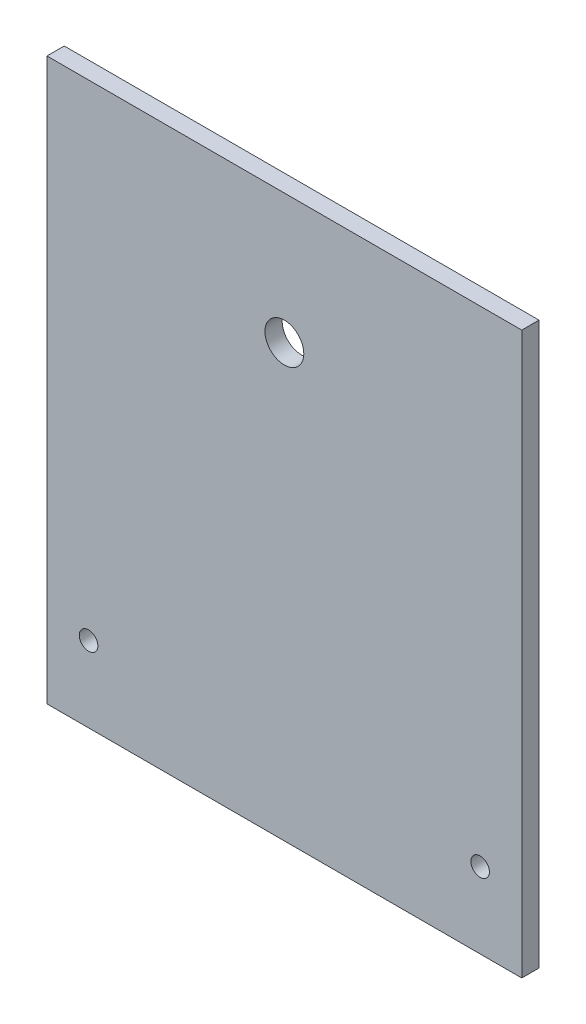
ISO-10303-21;
HEADER;
FILE_DESCRIPTION(('STEP AP214'),'2;1');
FILE_NAME('part.step','',(''),(''),'','','');
FILE_SCHEMA(('AUTOMOTIVE_DESIGN { 1 0 10303 214 1 1 1 1 }'));
ENDSEC;
DATA;
#1=APPLICATION_CONTEXT('core data for automotive mechanical design processes');
#2=APPLICATION_PROTOCOL_DEFINITION('international standard','automotive_design',2000,#1);
#3=PRODUCT_CONTEXT('',#1,'mechanical');
#4=PRODUCT('Part','Part','',(#3));
#5=PRODUCT_RELATED_PRODUCT_CATEGORY('part','',(#4));
#6=PRODUCT_DEFINITION_FORMATION('','',#4);
#7=PRODUCT_DEFINITION_CONTEXT('part definition',#1,'design');
#8=PRODUCT_DEFINITION('design','',#6,#7);
#9=PRODUCT_DEFINITION_SHAPE('','',#8);
#10=(LENGTH_UNIT() NAMED_UNIT(*) SI_UNIT(.MILLI.,.METRE.));
#11=(NAMED_UNIT(*) PLANE_ANGLE_UNIT() SI_UNIT($,.RADIAN.));
#12=(NAMED_UNIT(*) SI_UNIT($,.STERADIAN.) SOLID_ANGLE_UNIT());
#13=UNCERTAINTY_MEASURE_WITH_UNIT(LENGTH_MEASURE(1.E-05),#10,'distance_accuracy_value','');
#14=(GEOMETRIC_REPRESENTATION_CONTEXT(3) GLOBAL_UNCERTAINTY_ASSIGNED_CONTEXT((#13)) GLOBAL_UNIT_ASSIGNED_CONTEXT((#10,
#11,#12)) REPRESENTATION_CONTEXT('',''));
#15=CARTESIAN_POINT('',(0.,0.,0.));
#16=DIRECTION('',(0.,0.,1.));
#17=DIRECTION('',(1.,0.,0.));
#18=AXIS2_PLACEMENT_3D('',#15,#16,#17);
#19=CARTESIAN_POINT('',(55.,65.,4.));
#20=DIRECTION('',(-1.,0.,0.));
#21=DIRECTION('',(0.,-1.,0.));
#22=AXIS2_PLACEMENT_3D('',#19,#20,#21);
#23=PLANE('',#22);
#24=DIRECTION('',(0.,1.,0.));
#25=VECTOR('',#24,1.);
#26=CARTESIAN_POINT('',(55.,65.,0.));
#27=LINE('',#26,#25);
#28=CARTESIAN_POINT('',(55.,-65.,0.));
#29=VERTEX_POINT('',#28);
#30=CARTESIAN_POINT('',(55.,65.,0.));
#31=VERTEX_POINT('',#30);
#32=EDGE_CURVE('E95',#29,#31,#27,.T.);
#33=ORIENTED_EDGE('',*,*,#32,.T.);
#34=DIRECTION('',(0.,0.,-1.));
#35=VECTOR('',#34,1.);
#36=CARTESIAN_POINT('',(55.,65.,4.));
#37=LINE('',#36,#35);
#38=CARTESIAN_POINT('',(55.,65.,4.));
#39=VERTEX_POINT('',#38);
#40=EDGE_CURVE('E11',#39,#31,#37,.T.);
#41=ORIENTED_EDGE('',*,*,#40,.F.);
#42=DIRECTION('',(0.,1.,0.));
#43=VECTOR('',#42,1.);
#44=CARTESIAN_POINT('',(55.,65.,4.));
#45=LINE('',#44,#43);
#46=CARTESIAN_POINT('',(55.,-65.,4.));
#47=VERTEX_POINT('',#46);
#48=EDGE_CURVE('E83',#47,#39,#45,.T.);
#49=ORIENTED_EDGE('',*,*,#48,.F.);
#50=DIRECTION('',(0.,0.,-1.));
#51=VECTOR('',#50,1.);
#52=CARTESIAN_POINT('',(55.,-65.,4.));
#53=LINE('',#52,#51);
#54=EDGE_CURVE('E91',#47,#29,#53,.T.);
#55=ORIENTED_EDGE('',*,*,#54,.T.);
#56=EDGE_LOOP('',(#33,#41,#49,#55));
#57=FACE_BOUND('',#56,.T.);
#58=ADVANCED_FACE('F32',(#57),#23,.F.);
#59=CARTESIAN_POINT('',(-55.,65.,4.));
#60=DIRECTION('',(0.,-1.,0.));
#61=DIRECTION('',(0.,0.,-1.));
#62=AXIS2_PLACEMENT_3D('',#59,#60,#61);
#63=PLANE('',#62);
#64=DIRECTION('',(-1.,0.,0.));
#65=VECTOR('',#64,1.);
#66=CARTESIAN_POINT('',(-55.,65.,0.));
#67=LINE('',#66,#65);
#68=CARTESIAN_POINT('',(-55.,65.,0.));
#69=VERTEX_POINT('',#68);
#70=EDGE_CURVE('E87',#31,#69,#67,.T.);
#71=ORIENTED_EDGE('',*,*,#70,.T.);
#72=DIRECTION('',(0.,0.,-1.));
#73=VECTOR('',#72,1.);
#74=CARTESIAN_POINT('',(-55.,65.,4.));
#75=LINE('',#74,#73);
#76=CARTESIAN_POINT('',(-55.,65.,4.));
#77=VERTEX_POINT('',#76);
#78=EDGE_CURVE('E40',#77,#69,#75,.T.);
#79=ORIENTED_EDGE('',*,*,#78,.F.);
#80=DIRECTION('',(-1.,0.,0.));
#81=VECTOR('',#80,1.);
#82=CARTESIAN_POINT('',(-55.,65.,4.));
#83=LINE('',#82,#81);
#84=EDGE_CURVE('E78',#39,#77,#83,.T.);
#85=ORIENTED_EDGE('',*,*,#84,.F.);
#86=ORIENTED_EDGE('',*,*,#40,.T.);
#87=EDGE_LOOP('',(#71,#79,#85,#86));
#88=FACE_BOUND('',#87,.T.);
#89=ADVANCED_FACE('F86',(#88),#63,.F.);
#90=CARTESIAN_POINT('',(-55.,65.,4.));
#91=DIRECTION('',(1.,0.,0.));
#92=DIRECTION('',(0.,1.,0.));
#93=AXIS2_PLACEMENT_3D('',#90,#91,#92);
#94=PLANE('',#93);
#95=DIRECTION('',(0.,-1.,0.));
#96=VECTOR('',#95,1.);
#97=CARTESIAN_POINT('',(-55.,65.,0.));
#98=LINE('',#97,#96);
#99=CARTESIAN_POINT('',(-55.,-65.,0.));
#100=VERTEX_POINT('',#99);
#101=EDGE_CURVE('E65',#69,#100,#98,.T.);
#102=ORIENTED_EDGE('',*,*,#101,.T.);
#103=DIRECTION('',(0.,0.,-1.));
#104=VECTOR('',#103,1.);
#105=CARTESIAN_POINT('',(-55.,-65.,4.));
#106=LINE('',#105,#104);
#107=CARTESIAN_POINT('',(-55.,-65.,4.));
#108=VERTEX_POINT('',#107);
#109=EDGE_CURVE('E88',#108,#100,#106,.T.);
#110=ORIENTED_EDGE('',*,*,#109,.F.);
#111=DIRECTION('',(0.,-1.,0.));
#112=VECTOR('',#111,1.);
#113=CARTESIAN_POINT('',(-55.,65.,4.));
#114=LINE('',#113,#112);
#115=EDGE_CURVE('E81',#77,#108,#114,.T.);
#116=ORIENTED_EDGE('',*,*,#115,.F.);
#117=ORIENTED_EDGE('',*,*,#78,.T.);
#118=EDGE_LOOP('',(#102,#110,#116,#117));
#119=FACE_BOUND('',#118,.T.);
#120=ADVANCED_FACE('F89',(#119),#94,.F.);
#121=CARTESIAN_POINT('',(-55.,-65.,4.));
#122=DIRECTION('',(0.,1.,0.));
#123=DIRECTION('',(0.,0.,1.));
#124=AXIS2_PLACEMENT_3D('',#121,#122,#123);
#125=PLANE('',#124);
#126=DIRECTION('',(1.,0.,0.));
#127=VECTOR('',#126,1.);
#128=CARTESIAN_POINT('',(-55.,-65.,0.));
#129=LINE('',#128,#127);
#130=EDGE_CURVE('E71',#100,#29,#129,.T.);
#131=ORIENTED_EDGE('',*,*,#130,.T.);
#132=ORIENTED_EDGE('',*,*,#54,.F.);
#133=DIRECTION('',(1.,0.,0.));
#134=VECTOR('',#133,1.);
#135=CARTESIAN_POINT('',(-55.,-65.,4.));
#136=LINE('',#135,#134);
#137=EDGE_CURVE('E48',#108,#47,#136,.T.);
#138=ORIENTED_EDGE('',*,*,#137,.F.);
#139=ORIENTED_EDGE('',*,*,#109,.T.);
#140=EDGE_LOOP('',(#131,#132,#138,#139));
#141=FACE_BOUND('',#140,.T.);
#142=ADVANCED_FACE('F103',(#141),#125,.F.);
#143=CARTESIAN_POINT('',(0.,0.,4.));
#144=DIRECTION('',(0.,0.,1.));
#145=DIRECTION('',(1.,0.,0.));
#146=AXIS2_PLACEMENT_3D('',#143,#144,#145);
#147=PLANE('',#146);
#148=CARTESIAN_POINT('',(45.3611285403604,-47.475954890935,4.));
#149=DIRECTION('',(0.,0.,1.));
#150=DIRECTION('',(1.,0.,0.));
#151=AXIS2_PLACEMENT_3D('',#148,#149,#150);
#152=CIRCLE('',#151,2.15);
#153=CARTESIAN_POINT('',(47.5111285403604,-47.475954890935,4.));
#154=VERTEX_POINT('',#153);
#155=EDGE_CURVE('E121',#154,#154,#152,.T.);
#156=ORIENTED_EDGE('',*,*,#155,.F.);
#157=EDGE_LOOP('',(#156));
#158=FACE_BOUND('',#157,.T.);
#159=CARTESIAN_POINT('',(-45.3611285403604,-47.475954890935,4.));
#160=DIRECTION('',(0.,0.,1.));
#161=DIRECTION('',(1.,0.,0.));
#162=AXIS2_PLACEMENT_3D('',#159,#160,#161);
#163=CIRCLE('',#162,2.15);
#164=CARTESIAN_POINT('',(-43.2111285403604,-47.475954890935,4.));
#165=VERTEX_POINT('',#164);
#166=EDGE_CURVE('E115',#165,#165,#163,.T.);
#167=ORIENTED_EDGE('',*,*,#166,.F.);
#168=EDGE_LOOP('',(#167));
#169=FACE_BOUND('',#168,.T.);
#170=CARTESIAN_POINT('',(0.,34.9932912306538,4.));
#171=DIRECTION('',(0.,0.,1.));
#172=DIRECTION('',(1.,0.,0.));
#173=AXIS2_PLACEMENT_3D('',#170,#171,#172);
#174=CIRCLE('',#173,4.5);
#175=CARTESIAN_POINT('',(4.5,34.9932912306538,4.));
#176=VERTEX_POINT('',#175);
#177=EDGE_CURVE('E109',#176,#176,#174,.T.);
#178=ORIENTED_EDGE('',*,*,#177,.F.);
#179=EDGE_LOOP('',(#178));
#180=FACE_BOUND('',#179,.T.);
#181=ORIENTED_EDGE('',*,*,#48,.T.);
#182=ORIENTED_EDGE('',*,*,#84,.T.);
#183=ORIENTED_EDGE('',*,*,#115,.T.);
#184=ORIENTED_EDGE('',*,*,#137,.T.);
#185=EDGE_LOOP('',(#181,#182,#183,#184));
#186=FACE_BOUND('',#185,.T.);
#187=ADVANCED_FACE('F79',(#158,#169,#180,#186),#147,.T.);
#188=CARTESIAN_POINT('',(0.,0.,0.));
#189=DIRECTION('',(0.,0.,1.));
#190=DIRECTION('',(1.,0.,0.));
#191=AXIS2_PLACEMENT_3D('',#188,#189,#190);
#192=PLANE('',#191);
#193=CARTESIAN_POINT('',(45.3611285403604,-47.475954890935,0.));
#194=DIRECTION('',(0.,0.,1.));
#195=DIRECTION('',(1.,0.,0.));
#196=AXIS2_PLACEMENT_3D('',#193,#194,#195);
#197=CIRCLE('',#196,2.15);
#198=CARTESIAN_POINT('',(47.5111285403604,-47.475954890935,0.));
#199=VERTEX_POINT('',#198);
#200=EDGE_CURVE('E118',#199,#199,#197,.T.);
#201=ORIENTED_EDGE('',*,*,#200,.T.);
#202=EDGE_LOOP('',(#201));
#203=FACE_BOUND('',#202,.T.);
#204=CARTESIAN_POINT('',(-45.3611285403604,-47.475954890935,0.));
#205=DIRECTION('',(0.,0.,1.));
#206=DIRECTION('',(1.,0.,0.));
#207=AXIS2_PLACEMENT_3D('',#204,#205,#206);
#208=CIRCLE('',#207,2.15);
#209=CARTESIAN_POINT('',(-43.2111285403604,-47.475954890935,0.));
#210=VERTEX_POINT('',#209);
#211=EDGE_CURVE('E112',#210,#210,#208,.T.);
#212=ORIENTED_EDGE('',*,*,#211,.T.);
#213=EDGE_LOOP('',(#212));
#214=FACE_BOUND('',#213,.T.);
#215=CARTESIAN_POINT('',(0.,34.9932912306538,0.));
#216=DIRECTION('',(0.,0.,1.));
#217=DIRECTION('',(1.,0.,0.));
#218=AXIS2_PLACEMENT_3D('',#215,#216,#217);
#219=CIRCLE('',#218,4.5);
#220=CARTESIAN_POINT('',(4.5,34.9932912306538,0.));
#221=VERTEX_POINT('',#220);
#222=EDGE_CURVE('E98',#221,#221,#219,.T.);
#223=ORIENTED_EDGE('',*,*,#222,.T.);
#224=EDGE_LOOP('',(#223));
#225=FACE_BOUND('',#224,.T.);
#226=ORIENTED_EDGE('',*,*,#32,.F.);
#227=ORIENTED_EDGE('',*,*,#130,.F.);
#228=ORIENTED_EDGE('',*,*,#101,.F.);
#229=ORIENTED_EDGE('',*,*,#70,.F.);
#230=EDGE_LOOP('',(#226,#227,#228,#229));
#231=FACE_BOUND('',#230,.T.);
#232=ADVANCED_FACE('F106',(#203,#214,#225,#231),#192,.F.);
#233=CARTESIAN_POINT('',(0.,34.9932912306538,0.));
#234=DIRECTION('',(0.,0.,1.));
#235=DIRECTION('',(1.,0.,0.));
#236=AXIS2_PLACEMENT_3D('',#233,#234,#235);
#237=CYLINDRICAL_SURFACE('',#236,4.5);
#238=ORIENTED_EDGE('',*,*,#222,.F.);
#239=EDGE_LOOP('',(#238));
#240=FACE_BOUND('',#239,.T.);
#241=ORIENTED_EDGE('',*,*,#177,.T.);
#242=EDGE_LOOP('',(#241));
#243=FACE_BOUND('',#242,.T.);
#244=ADVANCED_FACE('F143',(#240,#243),#237,.F.);
#245=CARTESIAN_POINT('',(-45.3611285403604,-47.475954890935,0.));
#246=DIRECTION('',(0.,0.,1.));
#247=DIRECTION('',(1.,0.,0.));
#248=AXIS2_PLACEMENT_3D('',#245,#246,#247);
#249=CYLINDRICAL_SURFACE('',#248,2.15);
#250=ORIENTED_EDGE('',*,*,#211,.F.);
#251=EDGE_LOOP('',(#250));
#252=FACE_BOUND('',#251,.T.);
#253=ORIENTED_EDGE('',*,*,#166,.T.);
#254=EDGE_LOOP('',(#253));
#255=FACE_BOUND('',#254,.T.);
#256=ADVANCED_FACE('F132',(#252,#255),#249,.F.);
#257=CARTESIAN_POINT('',(45.3611285403604,-47.475954890935,0.));
#258=DIRECTION('',(0.,0.,1.));
#259=DIRECTION('',(1.,0.,0.));
#260=AXIS2_PLACEMENT_3D('',#257,#258,#259);
#261=CYLINDRICAL_SURFACE('',#260,2.15);
#262=ORIENTED_EDGE('',*,*,#200,.F.);
#263=EDGE_LOOP('',(#262));
#264=FACE_BOUND('',#263,.T.);
#265=ORIENTED_EDGE('',*,*,#155,.T.);
#266=EDGE_LOOP('',(#265));
#267=FACE_BOUND('',#266,.T.);
#268=ADVANCED_FACE('F129',(#264,#267),#261,.F.);
#269=CLOSED_SHELL('',(#58,#89,#120,#142,#187,#232,#244,#256,#268));
#270=MANIFOLD_SOLID_BREP('B2',#269);
#271=ADVANCED_BREP_SHAPE_REPRESENTATION('',(#18,#270),#14);
#272=SHAPE_DEFINITION_REPRESENTATION(#9,#271);
ENDSEC;
END-ISO-10303-21;
